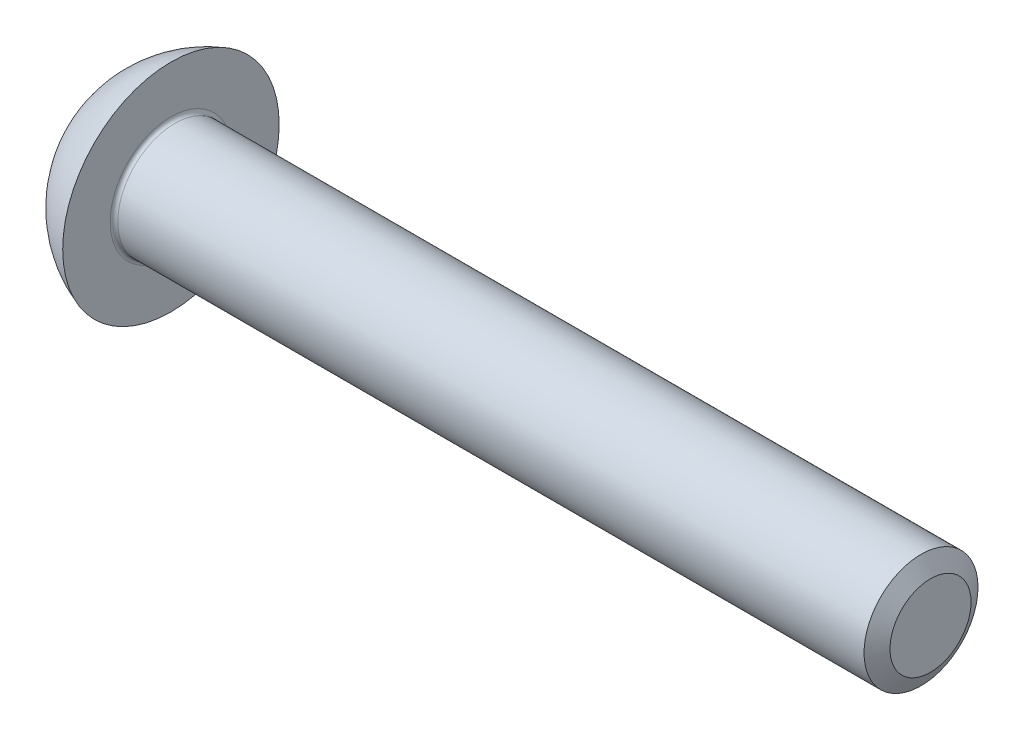
ISO-10303-21;
HEADER;
FILE_DESCRIPTION(('STEP AP214'),'2;1');
FILE_NAME('part.step','',(''),(''),'','','');
FILE_SCHEMA(('AUTOMOTIVE_DESIGN { 1 0 10303 214 1 1 1 1 }'));
ENDSEC;
DATA;
#1=APPLICATION_CONTEXT('core data for automotive mechanical design processes');
#2=APPLICATION_PROTOCOL_DEFINITION('international standard','automotive_design',2000,#1);
#3=PRODUCT_CONTEXT('',#1,'mechanical');
#4=PRODUCT('Part','Part','',(#3));
#5=PRODUCT_RELATED_PRODUCT_CATEGORY('part','',(#4));
#6=PRODUCT_DEFINITION_FORMATION('','',#4);
#7=PRODUCT_DEFINITION_CONTEXT('part definition',#1,'design');
#8=PRODUCT_DEFINITION('design','',#6,#7);
#9=PRODUCT_DEFINITION_SHAPE('','',#8);
#10=(LENGTH_UNIT() NAMED_UNIT(*) SI_UNIT(.MILLI.,.METRE.));
#11=(NAMED_UNIT(*) PLANE_ANGLE_UNIT() SI_UNIT($,.RADIAN.));
#12=(NAMED_UNIT(*) SI_UNIT($,.STERADIAN.) SOLID_ANGLE_UNIT());
#13=UNCERTAINTY_MEASURE_WITH_UNIT(LENGTH_MEASURE(1.E-05),#10,'distance_accuracy_value','');
#14=(GEOMETRIC_REPRESENTATION_CONTEXT(3) GLOBAL_UNCERTAINTY_ASSIGNED_CONTEXT((#13)) GLOBAL_UNIT_ASSIGNED_CONTEXT((#10,
#11,#12)) REPRESENTATION_CONTEXT('',''));
#15=CARTESIAN_POINT('',(0.,0.,0.));
#16=DIRECTION('',(0.,0.,1.));
#17=DIRECTION('',(1.,0.,0.));
#18=AXIS2_PLACEMENT_3D('',#15,#16,#17);
#19=CARTESIAN_POINT('',(-21.65,0.,0.));
#20=DIRECTION('',(-1.,0.,0.));
#21=DIRECTION('',(0.,0.,-1.));
#22=AXIS2_PLACEMENT_3D('',#19,#20,#21);
#23=CYLINDRICAL_SURFACE('',#22,1.5);
#24=CARTESIAN_POINT('',(-19.9,0.,0.));
#25=DIRECTION('',(1.,0.,0.));
#26=DIRECTION('',(0.,0.,-1.));
#27=AXIS2_PLACEMENT_3D('',#24,#25,#26);
#28=CIRCLE('',#27,1.5);
#29=CARTESIAN_POINT('',(-19.9,0.,-1.5));
#30=VERTEX_POINT('',#29);
#31=EDGE_CURVE('E186',#30,#30,#28,.T.);
#32=ORIENTED_EDGE('',*,*,#31,.T.);
#33=EDGE_LOOP('',(#32));
#34=FACE_BOUND('',#33,.T.);
#35=CARTESIAN_POINT('',(-0.25,0.,0.));
#36=DIRECTION('',(1.,0.,0.));
#37=DIRECTION('',(0.,0.,-1.));
#38=AXIS2_PLACEMENT_3D('',#35,#36,#37);
#39=CIRCLE('',#38,1.5);
#40=CARTESIAN_POINT('',(-0.25,0.,-1.5));
#41=VERTEX_POINT('',#40);
#42=EDGE_CURVE('E458',#41,#41,#39,.T.);
#43=ORIENTED_EDGE('',*,*,#42,.F.);
#44=EDGE_LOOP('',(#43));
#45=FACE_BOUND('',#44,.T.);
#46=ADVANCED_FACE('F43',(#34,#45),#23,.T.);
#47=CARTESIAN_POINT('',(-21.65,0.,0.));
#48=DIRECTION('',(1.,0.,0.));
#49=DIRECTION('',(0.,0.,1.));
#50=AXIS2_PLACEMENT_3D('',#47,#48,#49);
#51=PLANE('',#50);
#52=CARTESIAN_POINT('',(-21.65,0.,0.));
#53=DIRECTION('',(1.,0.,0.));
#54=DIRECTION('',(0.,0.,-1.));
#55=AXIS2_PLACEMENT_3D('',#52,#53,#54);
#56=CIRCLE('',#55,1.5);
#57=CARTESIAN_POINT('',(-21.65,1.5,0.));
#58=VERTEX_POINT('',#57);
#59=EDGE_CURVE('E178',#58,#58,#56,.T.);
#60=ORIENTED_EDGE('',*,*,#59,.F.);
#61=EDGE_LOOP('',(#60));
#62=FACE_BOUND('',#61,.T.);
#63=CARTESIAN_POINT('',(-21.65,0.,0.));
#64=DIRECTION('',(-1.,0.,0.));
#65=DIRECTION('',(0.,0.,1.));
#66=AXIS2_PLACEMENT_3D('',#63,#64,#65);
#67=CIRCLE('',#66,1.15470053837925);
#68=CARTESIAN_POINT('',(-21.65,-0.577350269189627,1.));
#69=VERTEX_POINT('',#68);
#70=CARTESIAN_POINT('',(-21.65,-1.15470053837925,0.));
#71=VERTEX_POINT('',#70);
#72=EDGE_CURVE('E11',#69,#71,#67,.F.);
#73=ORIENTED_EDGE('',*,*,#72,.T.);
#74=CARTESIAN_POINT('',(-21.65,-0.577350269189633,-0.999999999999999));
#75=VERTEX_POINT('',#74);
#76=EDGE_CURVE('E52',#71,#75,#67,.F.);
#77=ORIENTED_EDGE('',*,*,#76,.T.);
#78=CARTESIAN_POINT('',(-21.65,0.577350269189629,-1.));
#79=VERTEX_POINT('',#78);
#80=EDGE_CURVE('E294',#75,#79,#67,.F.);
#81=ORIENTED_EDGE('',*,*,#80,.T.);
#82=CARTESIAN_POINT('',(-21.65,0.,0.));
#83=DIRECTION('',(1.,0.,0.));
#84=DIRECTION('',(0.,0.,-1.));
#85=AXIS2_PLACEMENT_3D('',#82,#83,#84);
#86=CIRCLE('',#85,1.15470053837925);
#87=CARTESIAN_POINT('',(-21.65,1.15470053837925,0.));
#88=VERTEX_POINT('',#87);
#89=EDGE_CURVE('E212',#79,#88,#86,.T.);
#90=ORIENTED_EDGE('',*,*,#89,.T.);
#91=CARTESIAN_POINT('',(-21.65,0.577350269189628,1.));
#92=VERTEX_POINT('',#91);
#93=EDGE_CURVE('E128',#88,#92,#67,.F.);
#94=ORIENTED_EDGE('',*,*,#93,.T.);
#95=EDGE_CURVE('E47',#92,#69,#67,.F.);
#96=ORIENTED_EDGE('',*,*,#95,.T.);
#97=EDGE_LOOP('',(#73,#77,#81,#90,#94,#96));
#98=FACE_BOUND('',#97,.T.);
#99=ADVANCED_FACE('F45',(#62,#98),#51,.F.);
#100=CARTESIAN_POINT('',(-19.0454545454545,0.,0.));
#101=DIRECTION('',(-1.,0.,0.));
#102=DIRECTION('',(0.,1.,0.));
#103=AXIS2_PLACEMENT_3D('',#100,#101,#102);
#104=SPHERICAL_SURFACE('',#103,3.00560426949281);
#105=CARTESIAN_POINT('',(-20.,0.,0.));
#106=DIRECTION('',(1.,0.,0.));
#107=DIRECTION('',(0.,0.,-1.));
#108=AXIS2_PLACEMENT_3D('',#105,#106,#107);
#109=CIRCLE('',#108,2.85);
#110=CARTESIAN_POINT('',(-20.,2.85,0.));
#111=VERTEX_POINT('',#110);
#112=EDGE_CURVE('E181',#111,#111,#109,.T.);
#113=CARTESIAN_POINT('',(-21.65,1.5,0.));
#114=CARTESIAN_POINT('',(-21.6386705331495,1.51967216925547,0.));
#115=CARTESIAN_POINT('',(-21.6271181108235,1.53921593268643,0.));
#116=CARTESIAN_POINT('',(-21.6035734644196,1.57803672196104,0.));
#117=CARTESIAN_POINT('',(-21.5915812403415,1.59731374780468,0.));
#118=CARTESIAN_POINT('',(-21.5671630996322,1.6355911359664,0.));
#119=CARTESIAN_POINT('',(-21.554737183001,1.65459149828446,0.));
#120=CARTESIAN_POINT('',(-21.5294580495481,1.69230581219271,0.));
#121=CARTESIAN_POINT('',(-21.5166048327265,1.71101976378289,0.));
#122=CARTESIAN_POINT('',(-21.4904776944242,1.74815164624667,0.));
#123=CARTESIAN_POINT('',(-21.4772037729434,1.76656957712027,0.));
#124=CARTESIAN_POINT('',(-21.4502420411911,1.8030999627764,0.));
#125=CARTESIAN_POINT('',(-21.4365542309196,1.82121241755895,0.));
#126=CARTESIAN_POINT('',(-21.4087717487848,1.85712255178676,0.));
#127=CARTESIAN_POINT('',(-21.3946770769215,1.87492023123203,0.));
#128=CARTESIAN_POINT('',(-21.366088108,1.91019167733672,0.));
#129=CARTESIAN_POINT('',(-21.3515938109419,1.92766544399613,0.));
#130=CARTESIAN_POINT('',(-21.3222130331156,1.96228009332959,0.));
#131=CARTESIAN_POINT('',(-21.3073265523475,1.97942097600362,0.));
#132=CARTESIAN_POINT('',(-21.2771690499588,2.01336105708599,0.));
#133=CARTESIAN_POINT('',(-21.2618980283382,2.03016025549433,0.));
#134=CARTESIAN_POINT('',(-21.2309792845233,2.06340834318511,0.));
#135=CARTESIAN_POINT('',(-21.2153315623289,2.07985723246755,0.));
#136=CARTESIAN_POINT('',(-21.1836674510477,2.1123962568992,0.));
#137=CARTESIAN_POINT('',(-21.1676510619609,2.12848639204841,0.));
#138=CARTESIAN_POINT('',(-21.1352578398529,2.16029964739354,0.));
#139=CARTESIAN_POINT('',(-21.1188810068317,2.17602276758948,0.));
#140=CARTESIAN_POINT('',(-21.0857753048683,2.2070939206369,0.));
#141=CARTESIAN_POINT('',(-21.069046435926,2.22244195348838,0.));
#142=CARTESIAN_POINT('',(-21.0352452508718,2.25275505202893,0.));
#143=CARTESIAN_POINT('',(-21.01817293476,2.26772011771799,0.));
#144=CARTESIAN_POINT('',(-20.9836936204474,2.29725959873447,0.));
#145=CARTESIAN_POINT('',(-20.9662866222466,2.3118340140619,0.));
#146=CARTESIAN_POINT('',(-20.9311468806653,2.34058471171934,0.));
#147=CARTESIAN_POINT('',(-20.9134141372848,2.35476099404935,0.));
#148=CARTESIAN_POINT('',(-20.8776320094939,2.38270814748122,0.));
#149=CARTESIAN_POINT('',(-20.8595826250834,2.39647901858308,0.));
#150=CARTESIAN_POINT('',(-20.8231764819488,2.42360827946967,0.));
#151=CARTESIAN_POINT('',(-20.8048197232246,2.43696666925441,0.));
#152=CARTESIAN_POINT('',(-20.7678082559874,2.46326410918943,0.));
#153=CARTESIAN_POINT('',(-20.7491535474743,2.4762031593397,0.));
#154=CARTESIAN_POINT('',(-20.7115557581542,2.50165527698115,0.));
#155=CARTESIAN_POINT('',(-20.6926126773472,2.51416834447231,0.));
#156=CARTESIAN_POINT('',(-20.6544478689872,2.53876207247436,0.));
#157=CARTESIAN_POINT('',(-20.6352261414343,2.55084273298523,0.));
#158=CARTESIAN_POINT('',(-20.5965139081898,2.57456544470666,0.));
#159=CARTESIAN_POINT('',(-20.5770234024984,2.5862074959172,0.));
#160=CARTESIAN_POINT('',(-20.5377836195783,2.60904701190565,0.));
#161=CARTESIAN_POINT('',(-20.5180343423497,2.62024447668356,0.));
#162=CARTESIAN_POINT('',(-20.4782871558097,2.6421890709225,0.));
#163=CARTESIAN_POINT('',(-20.4582892464984,2.65293620038352,0.));
#164=CARTESIAN_POINT('',(-20.4180550629064,2.67397460633529,0.));
#165=CARTESIAN_POINT('',(-20.3978187886257,2.68426588282603,0.));
#166=CARTESIAN_POINT('',(-20.3571182645539,2.70438729913089,0.));
#167=CARTESIAN_POINT('',(-20.3366540147628,2.714217438945,0.));
#168=CARTESIAN_POINT('',(-20.2955080462974,2.73341153528513,0.));
#169=CARTESIAN_POINT('',(-20.2748263276231,2.74277549181114,0.));
#170=CARTESIAN_POINT('',(-20.2332560392077,2.7610324130256,0.));
#171=CARTESIAN_POINT('',(-20.2123674694665,2.76992537771404,0.));
#172=CARTESIAN_POINT('',(-20.1703942046549,2.78723575329491,0.));
#173=CARTESIAN_POINT('',(-20.1493095095844,2.79565316418733,0.));
#174=CARTESIAN_POINT('',(-20.1069548141172,2.81200809653372,0.));
#175=CARTESIAN_POINT('',(-20.0856848137203,2.8199456179877,0.));
#176=CARTESIAN_POINT('',(-20.0429704467276,2.83533674876495,0.));
#177=CARTESIAN_POINT('',(-20.0215260801317,2.84279035808822,0.));
#178=CARTESIAN_POINT('',(-20.,2.85,0.));
#179=B_SPLINE_CURVE_WITH_KNOTS('',3,(#113,#114,#115,#116,#117,#118,#119,#120,#121,#122,#123,
#124,#125,#126,#127,#128,#129,#130,#131,#132,#133,#134,#135,#136,#137,#138,#139,#140,#141,#142,
#143,#144,#145,#146,#147,#148,#149,#150,#151,#152,#153,#154,#155,#156,#157,#158,#159,#160,#161,
#162,#163,#164,#165,#166,#167,#168,#169,#170,#171,#172,#173,#174,#175,#176,#177,#178),
.UNSPECIFIED.,.F.,.F.,(4,2,2,2,2,2,2,2,2,2,2,2,2,2,2,2,2,2,2,2,2,2,2,2,2,2,2,2,2,2,2,2,4),(0.,
0.0681025747754098,0.136205149550819,0.204307724326227,0.272410299101637,0.340512873877047,
0.408615448652457,0.476718023427867,0.544820598203276,0.612923172978686,0.681025747754096,
0.749128322529507,0.817230897304914,0.885333472080325,0.953436046855734,1.02153862163114,
1.08964119640655,1.15774377118196,1.22584634595737,1.29394892073278,1.36205149550819,
1.4301540702836,1.49825664505901,1.56635921983442,1.63446179460983,1.70256436938524,
1.77066694416065,1.83876951893606,1.90687209371147,1.97497466848688,2.04307724326229,
2.1111798180377,2.17928239281311),.UNSPECIFIED.);
#180=EDGE_CURVE('BSEAM156',#58,#111,#179,.T.);
#181=ORIENTED_EDGE('',*,*,#59,.T.);
#182=ORIENTED_EDGE('',*,*,#112,.F.);
#183=ORIENTED_EDGE('',*,*,#180,.T.);
#184=ORIENTED_EDGE('',*,*,#180,.F.);
#185=EDGE_LOOP('',(#181,#183,#182,#184));
#186=FACE_BOUND('',#185,.T.);
#187=ADVANCED_FACE('F156',(#186),#104,.T.);
#188=CARTESIAN_POINT('',(-20.,1.6,0.));
#189=DIRECTION('',(-1.,0.,0.));
#190=DIRECTION('',(0.,0.,-1.));
#191=AXIS2_PLACEMENT_3D('',#188,#189,#190);
#192=PLANE('',#191);
#193=ORIENTED_EDGE('',*,*,#112,.T.);
#194=EDGE_LOOP('',(#193));
#195=FACE_BOUND('',#194,.T.);
#196=CARTESIAN_POINT('',(-20.,0.,0.));
#197=DIRECTION('',(1.,0.,0.));
#198=DIRECTION('',(0.,0.,-1.));
#199=AXIS2_PLACEMENT_3D('',#196,#197,#198);
#200=CIRCLE('',#199,1.6);
#201=CARTESIAN_POINT('',(-20.,0.,-1.6));
#202=VERTEX_POINT('',#201);
#203=EDGE_CURVE('E182',#202,#202,#200,.T.);
#204=ORIENTED_EDGE('',*,*,#203,.F.);
#205=EDGE_LOOP('',(#204));
#206=FACE_BOUND('',#205,.T.);
#207=ADVANCED_FACE('F166',(#195,#206),#192,.F.);
#208=CARTESIAN_POINT('',(-19.9,0.,0.));
#209=DIRECTION('',(-1.,0.,0.));
#210=DIRECTION('',(0.,0.,-1.));
#211=AXIS2_PLACEMENT_3D('',#208,#209,#210);
#212=TOROIDAL_SURFACE('',#211,1.6,0.100000000000001);
#213=ORIENTED_EDGE('',*,*,#203,.T.);
#214=EDGE_LOOP('',(#213));
#215=FACE_BOUND('',#214,.T.);
#216=ORIENTED_EDGE('',*,*,#31,.F.);
#217=EDGE_LOOP('',(#216));
#218=FACE_BOUND('',#217,.T.);
#219=ADVANCED_FACE('F149',(#215,#218),#212,.F.);
#220=CARTESIAN_POINT('',(-21.35,0.,0.));
#221=DIRECTION('',(-1.,0.,0.));
#222=DIRECTION('',(0.,0.,-1.));
#223=AXIS2_PLACEMENT_3D('',#220,#221,#222);
#224=CONICAL_SURFACE('',#223,0.,1.31660847419538);
#225=CARTESIAN_POINT('',(-21.8201338061757,-1.5081300450323,1.));
#226=CARTESIAN_POINT('',(-21.8103550434582,-1.46296169551438,1.));
#227=CARTESIAN_POINT('',(-21.8007010634319,-1.41776633015547,1.));
#228=CARTESIAN_POINT('',(-21.7817057249496,-1.32730802004725,1.));
#229=CARTESIAN_POINT('',(-21.7723643798043,-1.28204507250605,1.));
#230=CARTESIAN_POINT('',(-21.744887707109,-1.1460540932135,1.));
#231=CARTESIAN_POINT('',(-21.727318593487,-1.05520983554783,1.));
#232=CARTESIAN_POINT('',(-21.6946113120355,-0.873838301527069,1.));
#233=CARTESIAN_POINT('',(-21.6794545669183,-0.783314439111169,1.));
#234=CARTESIAN_POINT('',(-21.6526000869216,-0.601754544937858,1.));
#235=CARTESIAN_POINT('',(-21.6409016960468,-0.510718613654571,1.));
#236=CARTESIAN_POINT('',(-21.6224688104588,-0.32714728936339,1.));
#237=CARTESIAN_POINT('',(-21.615787761882,-0.234606191530869,1.));
#238=CARTESIAN_POINT('',(-21.6090368362792,-0.0493046546038942,1.));
#239=CARTESIAN_POINT('',(-21.6089640024594,0.04345566782023,1.));
#240=CARTESIAN_POINT('',(-21.6154534933963,0.229083736297403,1.));
#241=CARTESIAN_POINT('',(-21.6220414736928,0.321950510989406,1.));
#242=CARTESIAN_POINT('',(-21.6404572139866,0.507192547661315,1.));
#243=CARTESIAN_POINT('',(-21.6522884816114,0.59956743864776,1.));
#244=CARTESIAN_POINT('',(-21.6798118313046,0.785811374344468,1.));
#245=CARTESIAN_POINT('',(-21.6955836030667,0.879668210998819,1.));
#246=CARTESIAN_POINT('',(-21.7295232966728,1.06695285350417,1.));
#247=CARTESIAN_POINT('',(-21.7476915787193,1.16038059267177,1.));
#248=CARTESIAN_POINT('',(-21.7855853163011,1.34694314919725,1.));
#249=CARTESIAN_POINT('',(-21.8053112029702,1.44007787798178,1.));
#250=CARTESIAN_POINT('',(-21.8457971322914,1.62612272763755,1.));
#251=CARTESIAN_POINT('',(-21.866557196056,1.71903284388273,1.));
#252=CARTESIAN_POINT('',(-21.9085485742601,1.90363742744431,1.));
#253=CARTESIAN_POINT('',(-21.9297718689088,1.99533372655925,1.));
#254=CARTESIAN_POINT('',(-21.9727143057913,2.17861191601366,1.));
#255=CARTESIAN_POINT('',(-21.9944334585808,2.27019380387373,1.));
#256=CARTESIAN_POINT('',(-22.0382042420233,2.45314970796373,1.));
#257=CARTESIAN_POINT('',(-22.0602553943374,2.54452383886908,1.));
#258=CARTESIAN_POINT('',(-22.1046332471854,2.72720190599483,1.));
#259=CARTESIAN_POINT('',(-22.1269599382911,2.81850584450411,1.));
#260=CARTESIAN_POINT('',(-22.1493826695211,2.9097859214388,1.));
#261=B_SPLINE_CURVE_WITH_KNOTS('',3,(#225,#226,#227,#228,#229,#230,#231,#232,#233,#234,#235,
#236,#237,#238,#239,#240,#241,#242,#243,#244,#245,#246,#247,#248,#249,#250,#251,#252,#253,#254,
#255,#256,#257,#258,#259,#260),.UNSPECIFIED.,.F.,.F.,(4,2,2,2,2,2,2,2,2,2,2,2,2,2,2,2,2,4),(0.,
0.138643869889782,0.277293635233151,0.554857004517541,0.830167022781704,1.10542478551794,
1.38357462934897,1.66160001660695,1.94070037269331,2.21998772241579,2.50545939030144,
2.79097401441239,3.07656794584651,3.36216771000261,3.64452690710852,3.92689212062334,
4.20888343548738,4.49086512790397),.UNSPECIFIED.);
#262=EDGE_CURVE('E105',#69,#92,#261,.T.);
#263=ORIENTED_EDGE('',*,*,#262,.F.);
#264=ORIENTED_EDGE('',*,*,#95,.F.);
#265=EDGE_LOOP('',(#263,#264));
#266=FACE_BOUND('',#265,.T.);
#267=ADVANCED_FACE('F120',(#266),#224,.F.);
#268=CARTESIAN_POINT('',(-21.6500300044995,0.57723479913579,1.0002));
#269=CARTESIAN_POINT('',(-21.6437929192042,0.601225021738601,0.958647715567044));
#270=CARTESIAN_POINT('',(-21.6381313786167,0.625256195021443,0.917024502475672));
#271=CARTESIAN_POINT('',(-21.6281854217223,0.673398386330441,0.833639781140785));
#272=CARTESIAN_POINT('',(-21.6239015302713,0.697509431260086,0.791878226299065));
#273=CARTESIAN_POINT('',(-21.6169589031667,0.745673772514857,0.708455140132715));
#274=CARTESIAN_POINT('',(-21.6142923745456,0.769726780462719,0.66679410829216));
#275=CARTESIAN_POINT('',(-21.6107168929941,0.817861664223351,0.583422044002323));
#276=CARTESIAN_POINT('',(-21.6098076211353,0.841943534003896,0.541711022001162));
#277=CARTESIAN_POINT('',(-21.6098076211353,0.890107273564986,0.458288977998839));
#278=CARTESIAN_POINT('',(-21.6107168929941,0.914189143345531,0.416577955997678));
#279=CARTESIAN_POINT('',(-21.6142923745456,0.962324027106163,0.333205891707841));
#280=CARTESIAN_POINT('',(-21.6169589031667,0.986377035054025,0.291544859867286));
#281=CARTESIAN_POINT('',(-21.6239015302713,1.0345413763088,0.208121773700937));
#282=CARTESIAN_POINT('',(-21.6281854217223,1.05865242123844,0.166360218859217));
#283=CARTESIAN_POINT('',(-21.6381313786167,1.10679461254744,0.0829754975243298));
#284=CARTESIAN_POINT('',(-21.6437929192042,1.13082578583028,0.041352284432957));
#285=CARTESIAN_POINT('',(-21.6500300044996,1.15481600843309,-0.000199999999998983));
#286=B_SPLINE_CURVE_WITH_KNOTS('',3,(#268,#269,#270,#271,#272,#273,#274,#275,#276,#277,#278,
#279,#280,#281,#282,#283,#284,#285),.UNSPECIFIED.,.F.,.F.,(4,2,2,2,2,2,2,2,4),(0.,
0.145159524820138,0.290374287087485,0.434883682122849,0.57936684736763,0.723850012612412,
0.868359407647777,1.01357416991512,1.15873369473526),.UNSPECIFIED.);
#287=EDGE_CURVE('E122',#92,#88,#286,.T.);
#288=ORIENTED_EDGE('',*,*,#287,.F.);
#289=ORIENTED_EDGE('',*,*,#93,.F.);
#290=EDGE_LOOP('',(#288,#289));
#291=FACE_BOUND('',#290,.T.);
#292=ADVANCED_FACE('F148',(#291),#224,.F.);
#293=CARTESIAN_POINT('',(-21.6500300044996,1.15481600843309,0.000200000000000797));
#294=CARTESIAN_POINT('',(-21.6437929192042,1.13082578583028,-0.0413522844329553));
#295=CARTESIAN_POINT('',(-21.6381313786167,1.10679461254744,-0.0829754975243281));
#296=CARTESIAN_POINT('',(-21.6281854217223,1.05865242123844,-0.166360218859215));
#297=CARTESIAN_POINT('',(-21.6239015302713,1.0345413763088,-0.208121773700935));
#298=CARTESIAN_POINT('',(-21.6169589031667,0.986377035054025,-0.291544859867285));
#299=CARTESIAN_POINT('',(-21.6142923745456,0.962324027106163,-0.33320589170784));
#300=CARTESIAN_POINT('',(-21.6107168929941,0.914189143345531,-0.416577955997676));
#301=CARTESIAN_POINT('',(-21.6098076211353,0.890107273564986,-0.458288977998838));
#302=CARTESIAN_POINT('',(-21.6098076211353,0.841943534003896,-0.541711022001161));
#303=CARTESIAN_POINT('',(-21.6107168929941,0.817861664223351,-0.583422044002322));
#304=CARTESIAN_POINT('',(-21.6142923745456,0.769726780462719,-0.666794108292158));
#305=CARTESIAN_POINT('',(-21.6169589031667,0.745673772514857,-0.708455140132713));
#306=CARTESIAN_POINT('',(-21.6239015302713,0.697509431260086,-0.791878226299063));
#307=CARTESIAN_POINT('',(-21.6281854217223,0.673398386330441,-0.833639781140783));
#308=CARTESIAN_POINT('',(-21.6381313786167,0.625256195021443,-0.91702450247567));
#309=CARTESIAN_POINT('',(-21.6437929192042,0.601225021738601,-0.958647715567043));
#310=CARTESIAN_POINT('',(-21.6500300044995,0.57723479913579,-1.0002));
#311=B_SPLINE_CURVE_WITH_KNOTS('',3,(#293,#294,#295,#296,#297,#298,#299,#300,#301,#302,#303,
#304,#305,#306,#307,#308,#309,#310),.UNSPECIFIED.,.F.,.F.,(4,2,2,2,2,2,2,2,4),(0.,
0.145159524820138,0.290374287087485,0.43488368212285,0.579366847367631,0.723850012612412,
0.868359407647777,1.01357416991512,1.15873369473526),.UNSPECIFIED.);
#312=EDGE_CURVE('E277',#88,#79,#311,.T.);
#313=ORIENTED_EDGE('',*,*,#312,.F.);
#314=ORIENTED_EDGE('',*,*,#89,.F.);
#315=EDGE_LOOP('',(#313,#314));
#316=FACE_BOUND('',#315,.T.);
#317=ADVANCED_FACE('F144',(#316),#224,.F.);
#318=CARTESIAN_POINT('',(-21.8201338061757,-1.5081300450323,-0.999999999999999));
#319=CARTESIAN_POINT('',(-21.8103550434582,-1.46296169551438,-0.999999999999999));
#320=CARTESIAN_POINT('',(-21.8007010634319,-1.41776633015547,-0.999999999999999));
#321=CARTESIAN_POINT('',(-21.7817057249496,-1.32730802004725,-0.999999999999999));
#322=CARTESIAN_POINT('',(-21.7723643798043,-1.28204507250605,-0.999999999999999));
#323=CARTESIAN_POINT('',(-21.744887707109,-1.1460540932135,-0.999999999999999));
#324=CARTESIAN_POINT('',(-21.727318593487,-1.05520983554783,-0.999999999999999));
#325=CARTESIAN_POINT('',(-21.6946113120355,-0.873838301527069,-0.999999999999999));
#326=CARTESIAN_POINT('',(-21.6794545669183,-0.78331443911117,-0.999999999999999));
#327=CARTESIAN_POINT('',(-21.6526000869216,-0.601754544937859,-0.999999999999999));
#328=CARTESIAN_POINT('',(-21.6409016960468,-0.510718613654572,-0.999999999999999));
#329=CARTESIAN_POINT('',(-21.6224688104588,-0.327147289363391,-0.999999999999999));
#330=CARTESIAN_POINT('',(-21.615787761882,-0.23460619153087,-0.999999999999999));
#331=CARTESIAN_POINT('',(-21.6090368362792,-0.0493046546038947,-0.999999999999999));
#332=CARTESIAN_POINT('',(-21.6089640024594,0.0434556678202297,-0.999999999999999));
#333=CARTESIAN_POINT('',(-21.6154534933963,0.229083736297403,-0.999999999999999));
#334=CARTESIAN_POINT('',(-21.6220414736928,0.321950510989406,-0.999999999999999));
#335=CARTESIAN_POINT('',(-21.6404572139866,0.507192547661315,-0.999999999999999));
#336=CARTESIAN_POINT('',(-21.6522884816114,0.59956743864776,-0.999999999999999));
#337=CARTESIAN_POINT('',(-21.6798118313046,0.785811374344468,-0.999999999999999));
#338=CARTESIAN_POINT('',(-21.6955836030667,0.87966821099882,-0.999999999999999));
#339=CARTESIAN_POINT('',(-21.7295232966728,1.06695285350417,-0.999999999999999));
#340=CARTESIAN_POINT('',(-21.7476915787193,1.16038059267177,-0.999999999999999));
#341=CARTESIAN_POINT('',(-21.7855853163011,1.34694314919725,-0.999999999999999));
#342=CARTESIAN_POINT('',(-21.8053112029702,1.44007787798179,-0.999999999999999));
#343=CARTESIAN_POINT('',(-21.8457971322914,1.62612272763755,-0.999999999999999));
#344=CARTESIAN_POINT('',(-21.866557196056,1.71903284388273,-0.999999999999999));
#345=CARTESIAN_POINT('',(-21.9085485742601,1.90363742744431,-0.999999999999999));
#346=CARTESIAN_POINT('',(-21.9297718689088,1.99533372655925,-0.999999999999999));
#347=CARTESIAN_POINT('',(-21.9727143057913,2.17861191601366,-0.999999999999999));
#348=CARTESIAN_POINT('',(-21.9944334585808,2.27019380387373,-0.999999999999999));
#349=CARTESIAN_POINT('',(-22.0382042420233,2.45314970796373,-0.999999999999999));
#350=CARTESIAN_POINT('',(-22.0602553943374,2.54452383886908,-0.999999999999999));
#351=CARTESIAN_POINT('',(-22.1046332471854,2.72720190599484,-0.999999999999999));
#352=CARTESIAN_POINT('',(-22.1269599382911,2.81850584450411,-0.999999999999999));
#353=CARTESIAN_POINT('',(-22.1493826695211,2.9097859214388,-0.999999999999999));
#354=B_SPLINE_CURVE_WITH_KNOTS('',3,(#318,#319,#320,#321,#322,#323,#324,#325,#326,#327,#328,
#329,#330,#331,#332,#333,#334,#335,#336,#337,#338,#339,#340,#341,#342,#343,#344,#345,#346,#347,
#348,#349,#350,#351,#352,#353),.UNSPECIFIED.,.F.,.F.,(4,2,2,2,2,2,2,2,2,2,2,2,2,2,2,2,2,4),(0.,
0.138643869889783,0.277293635233152,0.554857004517541,0.830167022781703,1.10542478551794,
1.38357462934897,1.66160001660695,1.94070037269331,2.21998772241579,2.50545939030144,
2.79097401441239,3.07656794584652,3.36216771000261,3.64452690710852,3.92689212062334,
4.20888343548738,4.49086512790397),.UNSPECIFIED.);
#355=EDGE_CURVE('E271',#79,#75,#354,.F.);
#356=ORIENTED_EDGE('',*,*,#355,.F.);
#357=ORIENTED_EDGE('',*,*,#80,.F.);
#358=EDGE_LOOP('',(#356,#357));
#359=FACE_BOUND('',#358,.T.);
#360=ADVANCED_FACE('F142',(#359),#224,.F.);
#361=CARTESIAN_POINT('',(-21.6500300044995,-0.577234799135789,-1.0002));
#362=CARTESIAN_POINT('',(-21.6437929192042,-0.6012250217386,-0.958647715567043));
#363=CARTESIAN_POINT('',(-21.6381313786167,-0.625256195021441,-0.91702450247567));
#364=CARTESIAN_POINT('',(-21.6281854217223,-0.67339838633044,-0.833639781140783));
#365=CARTESIAN_POINT('',(-21.6239015302713,-0.697509431260085,-0.791878226299063));
#366=CARTESIAN_POINT('',(-21.6169589031667,-0.745673772514856,-0.708455140132713));
#367=CARTESIAN_POINT('',(-21.6142923745456,-0.769726780462718,-0.666794108292158));
#368=CARTESIAN_POINT('',(-21.6107168929941,-0.81786166422335,-0.583422044002322));
#369=CARTESIAN_POINT('',(-21.6098076211353,-0.841943534003895,-0.54171102200116));
#370=CARTESIAN_POINT('',(-21.6098076211353,-0.890107273564985,-0.458288977998838));
#371=CARTESIAN_POINT('',(-21.6107168929941,-0.91418914334553,-0.416577955997676));
#372=CARTESIAN_POINT('',(-21.6142923745456,-0.962324027106161,-0.33320589170784));
#373=CARTESIAN_POINT('',(-21.6169589031667,-0.986377035054023,-0.291544859867285));
#374=CARTESIAN_POINT('',(-21.6239015302713,-1.03454137630879,-0.208121773700935));
#375=CARTESIAN_POINT('',(-21.6281854217223,-1.05865242123844,-0.166360218859215));
#376=CARTESIAN_POINT('',(-21.6381313786167,-1.10679461254744,-0.0829754975243279));
#377=CARTESIAN_POINT('',(-21.6437929192042,-1.13082578583028,-0.0413522844329551));
#378=CARTESIAN_POINT('',(-21.6500300044995,-1.15481600843309,0.000200000000000986));
#379=B_SPLINE_CURVE_WITH_KNOTS('',3,(#361,#362,#363,#364,#365,#366,#367,#368,#369,#370,#371,
#372,#373,#374,#375,#376,#377,#378),.UNSPECIFIED.,.F.,.F.,(4,2,2,2,2,2,2,2,4),(0.,
0.145159524820138,0.290374287087485,0.434883682122849,0.57936684736763,0.723850012612412,
0.868359407647776,1.01357416991512,1.15873369473526),.UNSPECIFIED.);
#380=EDGE_CURVE('E116',#75,#71,#379,.T.);
#381=ORIENTED_EDGE('',*,*,#380,.F.);
#382=ORIENTED_EDGE('',*,*,#76,.F.);
#383=EDGE_LOOP('',(#381,#382));
#384=FACE_BOUND('',#383,.T.);
#385=ADVANCED_FACE('F133',(#384),#224,.F.);
#386=CARTESIAN_POINT('',(-21.6500300044995,-1.15481600843309,-0.0001999999999991));
#387=CARTESIAN_POINT('',(-21.6437929192042,-1.13082578583028,0.0413522844329572));
#388=CARTESIAN_POINT('',(-21.6381313786167,-1.10679461254744,0.08297549752433));
#389=CARTESIAN_POINT('',(-21.6281854217223,-1.05865242123844,0.166360218859217));
#390=CARTESIAN_POINT('',(-21.6239015302713,-1.03454137630879,0.208121773700937));
#391=CARTESIAN_POINT('',(-21.6169589031667,-0.986377035054023,0.291544859867287));
#392=CARTESIAN_POINT('',(-21.6142923745456,-0.962324027106161,0.333205891707842));
#393=CARTESIAN_POINT('',(-21.6107168929941,-0.914189143345529,0.416577955997678));
#394=CARTESIAN_POINT('',(-21.6098076211353,-0.890107273564984,0.45828897799884));
#395=CARTESIAN_POINT('',(-21.6098076211353,-0.841943534003894,0.541711022001162));
#396=CARTESIAN_POINT('',(-21.6107168929941,-0.817861664223349,0.583422044002324));
#397=CARTESIAN_POINT('',(-21.6142923745456,-0.769726780462717,0.66679410829216));
#398=CARTESIAN_POINT('',(-21.6169589031667,-0.745673772514855,0.708455140132715));
#399=CARTESIAN_POINT('',(-21.6239015302713,-0.697509431260084,0.791878226299065));
#400=CARTESIAN_POINT('',(-21.6281854217223,-0.67339838633044,0.833639781140785));
#401=CARTESIAN_POINT('',(-21.6381313786167,-0.625256195021441,0.917024502475672));
#402=CARTESIAN_POINT('',(-21.6437929192042,-0.601225021738599,0.958647715567045));
#403=CARTESIAN_POINT('',(-21.6500300044995,-0.577234799135788,1.0002));
#404=B_SPLINE_CURVE_WITH_KNOTS('',3,(#386,#387,#388,#389,#390,#391,#392,#393,#394,#395,#396,
#397,#398,#399,#400,#401,#402,#403),.UNSPECIFIED.,.F.,.F.,(4,2,2,2,2,2,2,2,4),(0.,
0.145159524820138,0.290374287087485,0.43488368212285,0.579366847367631,0.723850012612412,
0.868359407647777,1.01357416991512,1.15873369473526),.UNSPECIFIED.);
#405=EDGE_CURVE('E112',#71,#69,#404,.T.);
#406=ORIENTED_EDGE('',*,*,#405,.F.);
#407=ORIENTED_EDGE('',*,*,#72,.F.);
#408=EDGE_LOOP('',(#406,#407));
#409=FACE_BOUND('',#408,.T.);
#410=ADVANCED_FACE('F130',(#409),#224,.F.);
#411=CARTESIAN_POINT('',(-20.61,0.,0.));
#412=DIRECTION('',(-1.,0.,0.));
#413=DIRECTION('',(0.,0.,-1.));
#414=AXIS2_PLACEMENT_3D('',#411,#412,#413);
#415=CONICAL_SURFACE('',#414,1.15470053837925,1.08478502970568);
#416=CARTESIAN_POINT('',(-20.,0.,0.));
#417=VERTEX_POINT('',#416);
#418=VERTEX_LOOP('',#417);
#419=FACE_BOUND('',#418,.T.);
#420=CARTESIAN_POINT('',(-20.9533777683403,-1.50230992873525,-0.999999999999999));
#421=CARTESIAN_POINT('',(-20.9340444769777,-1.45833854185076,-0.999999999999999));
#422=CARTESIAN_POINT('',(-20.9149232467738,-1.41427434344668,-0.999999999999999));
#423=CARTESIAN_POINT('',(-20.8772163059513,-1.32590919920825,-0.999999999999999));
#424=CARTESIAN_POINT('',(-20.8586306830292,-1.28160821599644,-0.999999999999999));
#425=CARTESIAN_POINT('',(-20.8036681478386,-1.14784319726152,-0.999999999999999));
#426=CARTESIAN_POINT('',(-20.7682844804861,-1.05796321251933,-0.999999999999999));
#427=CARTESIAN_POINT('',(-20.7014887265583,-0.876123438160721,-0.999999999999999));
#428=CARTESIAN_POINT('',(-20.670100993813,-0.78415457894225,-0.999999999999999));
#429=CARTESIAN_POINT('',(-20.6142698926597,-0.598229842457832,-0.999999999999999));
#430=CARTESIAN_POINT('',(-20.5898112637181,-0.504278829186387,-0.999999999999999));
#431=CARTESIAN_POINT('',(-20.561284211292,-0.361662527207036,-0.999999999999999));
#432=CARTESIAN_POINT('',(-20.5531336537351,-0.313821896859327,-0.999999999999999));
#433=CARTESIAN_POINT('',(-20.5400901383612,-0.217683951682428,-0.999999999999999));
#434=CARTESIAN_POINT('',(-20.5351973854909,-0.16938660831547,-0.999999999999999));
#435=CARTESIAN_POINT('',(-20.5290689217004,-0.0727543492205689,-0.999999999999999));
#436=CARTESIAN_POINT('',(-20.5278181907857,-0.0244204124532986,-0.999999999999999));
#437=CARTESIAN_POINT('',(-20.5290340461929,0.0721832270827304,-0.999999999999999));
#438=CARTESIAN_POINT('',(-20.5314996115354,0.120452943848543,-0.999999999999999));
#439=CARTESIAN_POINT('',(-20.5426858199704,0.247728096968899,-0.999999999999999));
#440=CARTESIAN_POINT('',(-20.554415626327,0.32647281707577,-0.999999999999999));
#441=CARTESIAN_POINT('',(-20.5853155073204,0.482611029430833,-0.999999999999999));
#442=CARTESIAN_POINT('',(-20.6045054158237,0.560000340052675,-0.999999999999999));
#443=CARTESIAN_POINT('',(-20.6484420949321,0.714868516061646,-0.999999999999999));
#444=CARTESIAN_POINT('',(-20.6732951431871,0.792316418029709,-0.999999999999999));
#445=CARTESIAN_POINT('',(-20.7131493499715,0.907307575681682,-0.999999999999999));
#446=CARTESIAN_POINT('',(-20.7268173023165,0.945326191835167,-0.999999999999999));
#447=CARTESIAN_POINT('',(-20.7548765004687,1.02108213718649,-0.999999999999999));
#448=CARTESIAN_POINT('',(-20.7692675113704,1.05881955322302,-0.999999999999999));
#449=CARTESIAN_POINT('',(-20.783948942311,1.0964438770373,-0.999999999999999));
#450=B_SPLINE_CURVE_WITH_KNOTS('',3,(#420,#421,#422,#423,#424,#425,#426,#427,#428,#429,#430,
#431,#432,#433,#434,#435,#436,#437,#438,#439,#440,#441,#442,#443,#444,#445,#446,#447,#448,#449),
.UNSPECIFIED.,.F.,.F.,(4,2,2,2,2,2,2,2,2,2,2,2,2,2,4),(0.,0.144099688332552,0.288222837954157,
0.577934102924423,0.86933417721438,1.16008739746132,1.30558498590577,1.45109172666275,
1.59599752995897,1.74086353048645,1.97918576956973,2.21814600788026,2.46202630637785,
2.58322416173437,2.70438289404451),.UNSPECIFIED.);
#451=CARTESIAN_POINT('',(-20.61,-0.577350269189627,-0.999999999999999));
#452=VERTEX_POINT('',#451);
#453=CARTESIAN_POINT('',(-20.61,0.577350269189628,-0.999999999999999));
#454=VERTEX_POINT('',#453);
#455=EDGE_CURVE('E253',#452,#454,#450,.T.);
#456=ORIENTED_EDGE('',*,*,#455,.F.);
#457=CARTESIAN_POINT('',(-20.6100610091491,-1.15481600843309,0.000200000000000695));
#458=CARTESIAN_POINT('',(-20.5967471675624,-1.12962940463222,-0.043424477453212));
#459=CARTESIAN_POINT('',(-20.5846484366666,-1.10426083729185,-0.0873641250019605));
#460=CARTESIAN_POINT('',(-20.5635159299897,-1.05315838414079,-0.175876170251014));
#461=CARTESIAN_POINT('',(-20.5544881451853,-1.02742388513837,-0.220449630030528));
#462=CARTESIAN_POINT('',(-20.5403368995943,-0.976221327464722,-0.309135061398767));
#463=CARTESIAN_POINT('',(-20.5351365451759,-0.950758767435701,-0.353237509059805));
#464=CARTESIAN_POINT('',(-20.5287989102245,-0.899728873053179,-0.441623878835206));
#465=CARTESIAN_POINT('',(-20.527657647587,-0.874161666034569,-0.485907580399069));
#466=CARTESIAN_POINT('',(-20.5294293203474,-0.825910520528173,-0.569481015939547));
#467=CARTESIAN_POINT('',(-20.5319054116845,-0.803222207850419,-0.608778326235426));
#468=CARTESIAN_POINT('',(-20.5399567288674,-0.757968213270524,-0.687160544093251));
#469=CARTESIAN_POINT('',(-20.5455343304689,-0.735402638782435,-0.726245265608602));
#470=CARTESIAN_POINT('',(-20.5595556697914,-0.69006577781157,-0.804771012265825));
#471=CARTESIAN_POINT('',(-20.5680513970794,-0.66729861830587,-0.844204889273722));
#472=CARTESIAN_POINT('',(-20.5874031221558,-0.622053201643479,-0.922572249742606));
#473=CARTESIAN_POINT('',(-20.5982552609432,-0.59957453503854,-0.961506442388764));
#474=CARTESIAN_POINT('',(-20.6100610091491,-0.577234799135789,-1.0002));
#475=B_SPLINE_CURVE_WITH_KNOTS('',3,(#457,#458,#459,#460,#461,#462,#463,#464,#465,#466,#467,
#468,#469,#470,#471,#472,#473,#474),.UNSPECIFIED.,.F.,.F.,(4,2,2,2,2,2,2,2,4),(0.,
0.156356652206858,0.313016607627112,0.466436255933324,0.619705352863253,0.755925705289371,
0.892250546480127,1.03114227500706,1.16980823889878),.UNSPECIFIED.);
#476=CARTESIAN_POINT('',(-20.61,-1.15470053837925,0.));
#477=VERTEX_POINT('',#476);
#478=EDGE_CURVE('E242',#477,#452,#475,.T.);
#479=ORIENTED_EDGE('',*,*,#478,.F.);
#480=CARTESIAN_POINT('',(-20.6100610091491,-0.577234799135788,1.0002));
#481=CARTESIAN_POINT('',(-20.5967471675624,-0.602421402936658,0.956575522546788));
#482=CARTESIAN_POINT('',(-20.5846484366666,-0.627789970277025,0.912635874998039));
#483=CARTESIAN_POINT('',(-20.5635159299897,-0.678892423428091,0.824123829748985));
#484=CARTESIAN_POINT('',(-20.5544881451853,-0.704626922430506,0.779550369969472));
#485=CARTESIAN_POINT('',(-20.5403368995943,-0.755829480104157,0.690864938601233));
#486=CARTESIAN_POINT('',(-20.5351365451759,-0.781292040133178,0.646762490940195));
#487=CARTESIAN_POINT('',(-20.5287989102245,-0.8323219345157,0.558376121164794));
#488=CARTESIAN_POINT('',(-20.527657647587,-0.85788914153431,0.51409241960093));
#489=CARTESIAN_POINT('',(-20.5294293203474,-0.906140287040706,0.430518984060453));
#490=CARTESIAN_POINT('',(-20.5319054116845,-0.92882859971846,0.391221673764574));
#491=CARTESIAN_POINT('',(-20.5399567288674,-0.974082594298355,0.312839455906749));
#492=CARTESIAN_POINT('',(-20.5455343304689,-0.996648168786445,0.273754734391398));
#493=CARTESIAN_POINT('',(-20.5595556697914,-1.04198502975731,0.195228987734175));
#494=CARTESIAN_POINT('',(-20.5680513970794,-1.06475218926301,0.155795110726278));
#495=CARTESIAN_POINT('',(-20.5874031221558,-1.1099976059254,0.0774277502573936));
#496=CARTESIAN_POINT('',(-20.5982552609432,-1.13247627253034,0.0384935576112364));
#497=CARTESIAN_POINT('',(-20.6100610091491,-1.15481600843309,-0.000199999999998944));
#498=B_SPLINE_CURVE_WITH_KNOTS('',3,(#480,#481,#482,#483,#484,#485,#486,#487,#488,#489,#490,
#491,#492,#493,#494,#495,#496,#497),.UNSPECIFIED.,.F.,.F.,(4,2,2,2,2,2,2,2,4),(0.,
0.156356652206858,0.313016607627112,0.466436255933324,0.619705352863253,0.755925705289371,
0.892250546480127,1.03114227500706,1.16980823889878),.UNSPECIFIED.);
#499=CARTESIAN_POINT('',(-20.61,-0.577350269189626,1.));
#500=VERTEX_POINT('',#499);
#501=EDGE_CURVE('E235',#500,#477,#498,.T.);
#502=ORIENTED_EDGE('',*,*,#501,.F.);
#503=CARTESIAN_POINT('',(-20.9533777683403,-1.50230992873526,1.));
#504=CARTESIAN_POINT('',(-20.9340444769777,-1.45833854185077,1.));
#505=CARTESIAN_POINT('',(-20.9149232467738,-1.41427434344668,1.));
#506=CARTESIAN_POINT('',(-20.8772163059513,-1.32590919920826,1.));
#507=CARTESIAN_POINT('',(-20.8586306830292,-1.28160821599644,1.));
#508=CARTESIAN_POINT('',(-20.8036681478386,-1.14784319726152,1.));
#509=CARTESIAN_POINT('',(-20.7682844804861,-1.05796321251933,1.));
#510=CARTESIAN_POINT('',(-20.7014887265583,-0.876123438160723,1.));
#511=CARTESIAN_POINT('',(-20.670100993813,-0.784154578942252,1.));
#512=CARTESIAN_POINT('',(-20.6142698926597,-0.598229842457833,1.));
#513=CARTESIAN_POINT('',(-20.5898112637181,-0.504278829186389,1.));
#514=CARTESIAN_POINT('',(-20.561284211292,-0.361662527207036,1.));
#515=CARTESIAN_POINT('',(-20.5531336537352,-0.313821896859327,1.));
#516=CARTESIAN_POINT('',(-20.5400901383612,-0.217683951682428,1.));
#517=CARTESIAN_POINT('',(-20.5351973854909,-0.169386608315468,1.));
#518=CARTESIAN_POINT('',(-20.5290689217004,-0.0727543492205665,1.));
#519=CARTESIAN_POINT('',(-20.5278181907857,-0.0244204124532959,1.));
#520=CARTESIAN_POINT('',(-20.5290340461929,0.072183227082734,1.));
#521=CARTESIAN_POINT('',(-20.5314996115354,0.120452943848547,1.));
#522=CARTESIAN_POINT('',(-20.5426858199704,0.247728096968904,1.));
#523=CARTESIAN_POINT('',(-20.554415626327,0.326472817075775,1.));
#524=CARTESIAN_POINT('',(-20.5853155073205,0.482611029430839,1.));
#525=CARTESIAN_POINT('',(-20.6045054158237,0.560000340052681,1.));
#526=CARTESIAN_POINT('',(-20.6484420949321,0.714868516061654,1.));
#527=CARTESIAN_POINT('',(-20.6732951431871,0.792316418029718,1.));
#528=CARTESIAN_POINT('',(-20.7131493499715,0.907307575681692,1.));
#529=CARTESIAN_POINT('',(-20.7268173023165,0.945326191835176,1.));
#530=CARTESIAN_POINT('',(-20.7548765004687,1.0210821371865,1.));
#531=CARTESIAN_POINT('',(-20.7692675113704,1.05881955322303,1.));
#532=CARTESIAN_POINT('',(-20.783948942311,1.09644387703731,1.));
#533=B_SPLINE_CURVE_WITH_KNOTS('',3,(#503,#504,#505,#506,#507,#508,#509,#510,#511,#512,#513,
#514,#515,#516,#517,#518,#519,#520,#521,#522,#523,#524,#525,#526,#527,#528,#529,#530,#531,#532),
.UNSPECIFIED.,.F.,.F.,(4,2,2,2,2,2,2,2,2,2,2,2,2,2,4),(0.,0.144099688332552,0.28822283795416,
0.577934102924429,0.869334177214384,1.16008739746132,1.30558498590577,1.45109172666276,
1.59599752995898,1.74086353048646,1.97918576956974,2.21814600788028,2.46202630637787,
2.58322416173438,2.70438289404453),.UNSPECIFIED.);
#534=CARTESIAN_POINT('',(-20.61,0.577350269189628,1.));
#535=VERTEX_POINT('',#534);
#536=EDGE_CURVE('E108',#535,#500,#533,.F.);
#537=ORIENTED_EDGE('',*,*,#536,.F.);
#538=CARTESIAN_POINT('',(-20.6100610091491,1.15481600843309,-0.000199999999998803));
#539=CARTESIAN_POINT('',(-20.5967471675624,1.12962940463222,0.0434244774532139));
#540=CARTESIAN_POINT('',(-20.5846484366666,1.10426083729186,0.0873641250019628));
#541=CARTESIAN_POINT('',(-20.5635159299897,1.05315838414079,0.175876170251017));
#542=CARTESIAN_POINT('',(-20.5544881451853,1.02742388513837,0.220449630030531));
#543=CARTESIAN_POINT('',(-20.5403368995943,0.976221327464723,0.30913506139877));
#544=CARTESIAN_POINT('',(-20.5351365451759,0.950758767435702,0.353237509059808));
#545=CARTESIAN_POINT('',(-20.5287989102245,0.89972887305318,0.441623878835208));
#546=CARTESIAN_POINT('',(-20.527657647587,0.87416166603457,0.485907580399072));
#547=CARTESIAN_POINT('',(-20.5294293203474,0.825910520528174,0.56948101593955));
#548=CARTESIAN_POINT('',(-20.5319054116845,0.80322220785042,0.608778326235428));
#549=CARTESIAN_POINT('',(-20.5399567288674,0.757968213270525,0.687160544093253));
#550=CARTESIAN_POINT('',(-20.5455343304689,0.735402638782436,0.726245265608604));
#551=CARTESIAN_POINT('',(-20.5595556697914,0.690065777811571,0.804771012265827));
#552=CARTESIAN_POINT('',(-20.5680513970794,0.667298618305872,0.844204889273724));
#553=CARTESIAN_POINT('',(-20.5874031221558,0.622053201643481,0.922572249742608));
#554=CARTESIAN_POINT('',(-20.5982552609432,0.599574535038541,0.961506442388765));
#555=CARTESIAN_POINT('',(-20.6100610091491,0.57723479913579,1.0002));
#556=B_SPLINE_CURVE_WITH_KNOTS('',3,(#538,#539,#540,#541,#542,#543,#544,#545,#546,#547,#548,
#549,#550,#551,#552,#553,#554,#555),.UNSPECIFIED.,.F.,.F.,(4,2,2,2,2,2,2,2,4),(0.,
0.156356652206859,0.313016607627112,0.466436255933325,0.619705352863253,0.755925705289371,
0.892250546480127,1.03114227500706,1.16980823889878),.UNSPECIFIED.);
#557=CARTESIAN_POINT('',(-20.61,1.15470053837925,0.));
#558=VERTEX_POINT('',#557);
#559=EDGE_CURVE('E129',#558,#535,#556,.T.);
#560=ORIENTED_EDGE('',*,*,#559,.F.);
#561=CARTESIAN_POINT('',(-20.6100610091491,0.57723479913579,-1.0002));
#562=CARTESIAN_POINT('',(-20.5967471675624,0.602421402936659,-0.956575522546786));
#563=CARTESIAN_POINT('',(-20.5846484366666,0.627789970277027,-0.912635874998038));
#564=CARTESIAN_POINT('',(-20.5635159299897,0.678892423428092,-0.824123829748984));
#565=CARTESIAN_POINT('',(-20.5544881451853,0.704626922430508,-0.77955036996947));
#566=CARTESIAN_POINT('',(-20.5403368995943,0.755829480104159,-0.690864938601231));
#567=CARTESIAN_POINT('',(-20.5351365451759,0.78129204013318,-0.646762490940193));
#568=CARTESIAN_POINT('',(-20.5287989102245,0.832321934515702,-0.558376121164792));
#569=CARTESIAN_POINT('',(-20.527657647587,0.857889141534312,-0.514092419600928));
#570=CARTESIAN_POINT('',(-20.5294293203474,0.906140287040708,-0.430518984060451));
#571=CARTESIAN_POINT('',(-20.5319054116845,0.928828599718462,-0.391221673764572));
#572=CARTESIAN_POINT('',(-20.5399567288674,0.974082594298357,-0.312839455906747));
#573=CARTESIAN_POINT('',(-20.5455343304689,0.996648168786446,-0.273754734391397));
#574=CARTESIAN_POINT('',(-20.5595556697914,1.04198502975731,-0.195228987734173));
#575=CARTESIAN_POINT('',(-20.5680513970794,1.06475218926301,-0.155795110726277));
#576=CARTESIAN_POINT('',(-20.5874031221558,1.1099976059254,-0.0774277502573925));
#577=CARTESIAN_POINT('',(-20.5982552609432,1.13247627253034,-0.0384935576112354));
#578=CARTESIAN_POINT('',(-20.6100610091491,1.15481600843309,0.000200000000000459));
#579=B_SPLINE_CURVE_WITH_KNOTS('',3,(#561,#562,#563,#564,#565,#566,#567,#568,#569,#570,#571,
#572,#573,#574,#575,#576,#577,#578),.UNSPECIFIED.,.F.,.F.,(4,2,2,2,2,2,2,2,4),(0.,
0.156356652206858,0.313016607627113,0.466436255933325,0.619705352863253,0.755925705289371,
0.892250546480127,1.03114227500706,1.16980823889878),.UNSPECIFIED.);
#580=EDGE_CURVE('E260',#454,#558,#579,.T.);
#581=ORIENTED_EDGE('',*,*,#580,.F.);
#582=EDGE_LOOP('',(#456,#479,#502,#537,#560,#581));
#583=FACE_BOUND('',#582,.T.);
#584=ADVANCED_FACE('F132',(#419,#583),#415,.F.);
#585=CARTESIAN_POINT('',(-20.,1.15470053837925,0.));
#586=DIRECTION('',(0.,0.866025403784438,0.5));
#587=DIRECTION('',(0.,0.5,-0.866025403784438));
#588=AXIS2_PLACEMENT_3D('',#585,#586,#587);
#589=PLANE('',#588);
#590=ORIENTED_EDGE('',*,*,#287,.T.);
#591=DIRECTION('',(-1.,0.,0.));
#592=VECTOR('',#591,1.);
#593=CARTESIAN_POINT('',(-20.,1.15470053837925,0.));
#594=LINE('',#593,#592);
#595=EDGE_CURVE('E289',#558,#88,#594,.T.);
#596=ORIENTED_EDGE('',*,*,#595,.F.);
#597=ORIENTED_EDGE('',*,*,#559,.T.);
#598=DIRECTION('',(-1.,0.,0.));
#599=VECTOR('',#598,1.);
#600=CARTESIAN_POINT('',(-20.,0.577350269189628,1.));
#601=LINE('',#600,#599);
#602=EDGE_CURVE('E110',#535,#92,#601,.T.);
#603=ORIENTED_EDGE('',*,*,#602,.T.);
#604=EDGE_LOOP('',(#590,#596,#597,#603));
#605=FACE_BOUND('',#604,.T.);
#606=ADVANCED_FACE('F138',(#605),#589,.F.);
#607=CARTESIAN_POINT('',(-20.,0.577350269189628,1.));
#608=DIRECTION('',(0.,0.,1.));
#609=DIRECTION('',(-1.,0.,0.));
#610=AXIS2_PLACEMENT_3D('',#607,#608,#609);
#611=PLANE('',#610);
#612=ORIENTED_EDGE('',*,*,#262,.T.);
#613=ORIENTED_EDGE('',*,*,#602,.F.);
#614=ORIENTED_EDGE('',*,*,#536,.T.);
#615=DIRECTION('',(-1.,0.,0.));
#616=VECTOR('',#615,1.);
#617=CARTESIAN_POINT('',(-20.,-0.577350269189626,1.));
#618=LINE('',#617,#616);
#619=EDGE_CURVE('E102',#500,#69,#618,.T.);
#620=ORIENTED_EDGE('',*,*,#619,.T.);
#621=EDGE_LOOP('',(#612,#613,#614,#620));
#622=FACE_BOUND('',#621,.T.);
#623=ADVANCED_FACE('F103',(#622),#611,.F.);
#624=CARTESIAN_POINT('',(-20.,-0.577350269189626,1.));
#625=DIRECTION('',(0.,-0.866025403784438,0.5));
#626=DIRECTION('',(0.,0.5,0.866025403784438));
#627=AXIS2_PLACEMENT_3D('',#624,#625,#626);
#628=PLANE('',#627);
#629=ORIENTED_EDGE('',*,*,#405,.T.);
#630=ORIENTED_EDGE('',*,*,#619,.F.);
#631=ORIENTED_EDGE('',*,*,#501,.T.);
#632=DIRECTION('',(-1.,0.,0.));
#633=VECTOR('',#632,1.);
#634=CARTESIAN_POINT('',(-20.,-1.15470053837925,0.));
#635=LINE('',#634,#633);
#636=EDGE_CURVE('E59',#477,#71,#635,.T.);
#637=ORIENTED_EDGE('',*,*,#636,.T.);
#638=EDGE_LOOP('',(#629,#630,#631,#637));
#639=FACE_BOUND('',#638,.T.);
#640=ADVANCED_FACE('F113',(#639),#628,.F.);
#641=CARTESIAN_POINT('',(-20.,-1.15470053837925,0.));
#642=DIRECTION('',(0.,-0.866025403784439,-0.5));
#643=DIRECTION('',(0.,-0.5,0.866025403784439));
#644=AXIS2_PLACEMENT_3D('',#641,#642,#643);
#645=PLANE('',#644);
#646=ORIENTED_EDGE('',*,*,#380,.T.);
#647=ORIENTED_EDGE('',*,*,#636,.F.);
#648=ORIENTED_EDGE('',*,*,#478,.T.);
#649=DIRECTION('',(-1.,0.,0.));
#650=VECTOR('',#649,1.);
#651=CARTESIAN_POINT('',(-20.,-0.577350269189627,-0.999999999999999));
#652=LINE('',#651,#650);
#653=EDGE_CURVE('E67',#452,#75,#652,.T.);
#654=ORIENTED_EDGE('',*,*,#653,.T.);
#655=EDGE_LOOP('',(#646,#647,#648,#654));
#656=FACE_BOUND('',#655,.T.);
#657=ADVANCED_FACE('F231',(#656),#645,.F.);
#658=CARTESIAN_POINT('',(-20.,-0.577350269189627,-0.999999999999999));
#659=DIRECTION('',(0.,0.,-1.));
#660=DIRECTION('',(1.,0.,0.));
#661=AXIS2_PLACEMENT_3D('',#658,#659,#660);
#662=PLANE('',#661);
#663=ORIENTED_EDGE('',*,*,#355,.T.);
#664=ORIENTED_EDGE('',*,*,#653,.F.);
#665=ORIENTED_EDGE('',*,*,#455,.T.);
#666=DIRECTION('',(-1.,0.,0.));
#667=VECTOR('',#666,1.);
#668=CARTESIAN_POINT('',(-20.,0.577350269189628,-0.999999999999999));
#669=LINE('',#668,#667);
#670=EDGE_CURVE('E287',#454,#79,#669,.T.);
#671=ORIENTED_EDGE('',*,*,#670,.T.);
#672=EDGE_LOOP('',(#663,#664,#665,#671));
#673=FACE_BOUND('',#672,.T.);
#674=ADVANCED_FACE('F266',(#673),#662,.F.);
#675=CARTESIAN_POINT('',(-20.,0.577350269189628,-0.999999999999999));
#676=DIRECTION('',(0.,0.866025403784438,-0.5));
#677=DIRECTION('',(0.,-0.5,-0.866025403784438));
#678=AXIS2_PLACEMENT_3D('',#675,#676,#677);
#679=PLANE('',#678);
#680=ORIENTED_EDGE('',*,*,#312,.T.);
#681=ORIENTED_EDGE('',*,*,#670,.F.);
#682=ORIENTED_EDGE('',*,*,#580,.T.);
#683=ORIENTED_EDGE('',*,*,#595,.T.);
#684=EDGE_LOOP('',(#680,#681,#682,#683));
#685=FACE_BOUND('',#684,.T.);
#686=ADVANCED_FACE('F202',(#685),#679,.F.);
#687=CARTESIAN_POINT('',(-0.25,0.,0.));
#688=DIRECTION('',(-1.,0.,0.));
#689=DIRECTION('',(0.,0.,-1.));
#690=AXIS2_PLACEMENT_3D('',#687,#688,#689);
#691=CONICAL_SURFACE('',#690,1.5,1.0471975511966);
#692=CARTESIAN_POINT('',(0.,0.,0.));
#693=DIRECTION('',(1.,0.,0.));
#694=DIRECTION('',(0.,0.,-1.));
#695=AXIS2_PLACEMENT_3D('',#692,#693,#694);
#696=CIRCLE('',#695,1.06698729810778);
#697=CARTESIAN_POINT('',(0.,0.,-1.06698729810778));
#698=VERTEX_POINT('',#697);
#699=EDGE_CURVE('E292',#698,#698,#696,.T.);
#700=ORIENTED_EDGE('',*,*,#699,.F.);
#701=EDGE_LOOP('',(#700));
#702=FACE_BOUND('',#701,.T.);
#703=ORIENTED_EDGE('',*,*,#42,.T.);
#704=EDGE_LOOP('',(#703));
#705=FACE_BOUND('',#704,.T.);
#706=ADVANCED_FACE('F335',(#702,#705),#691,.T.);
#707=CARTESIAN_POINT('',(0.,1.5,0.));
#708=DIRECTION('',(-1.,0.,0.));
#709=DIRECTION('',(0.,0.,-1.));
#710=AXIS2_PLACEMENT_3D('',#707,#708,#709);
#711=PLANE('',#710);
#712=ORIENTED_EDGE('',*,*,#699,.T.);
#713=EDGE_LOOP('',(#712));
#714=FACE_BOUND('',#713,.T.);
#715=ADVANCED_FACE('F162',(#714),#711,.F.);
#716=CLOSED_SHELL('',(#46,#99,#187,#207,#219,#267,#292,#317,#360,#385,#410,#584,#606,#623,#640,
#657,#674,#686,#706,#715));
#717=MANIFOLD_SOLID_BREP('B2',#716);
#718=ADVANCED_BREP_SHAPE_REPRESENTATION('',(#18,#717),#14);
#719=SHAPE_DEFINITION_REPRESENTATION(#9,#718);
ENDSEC;
END-ISO-10303-21;
